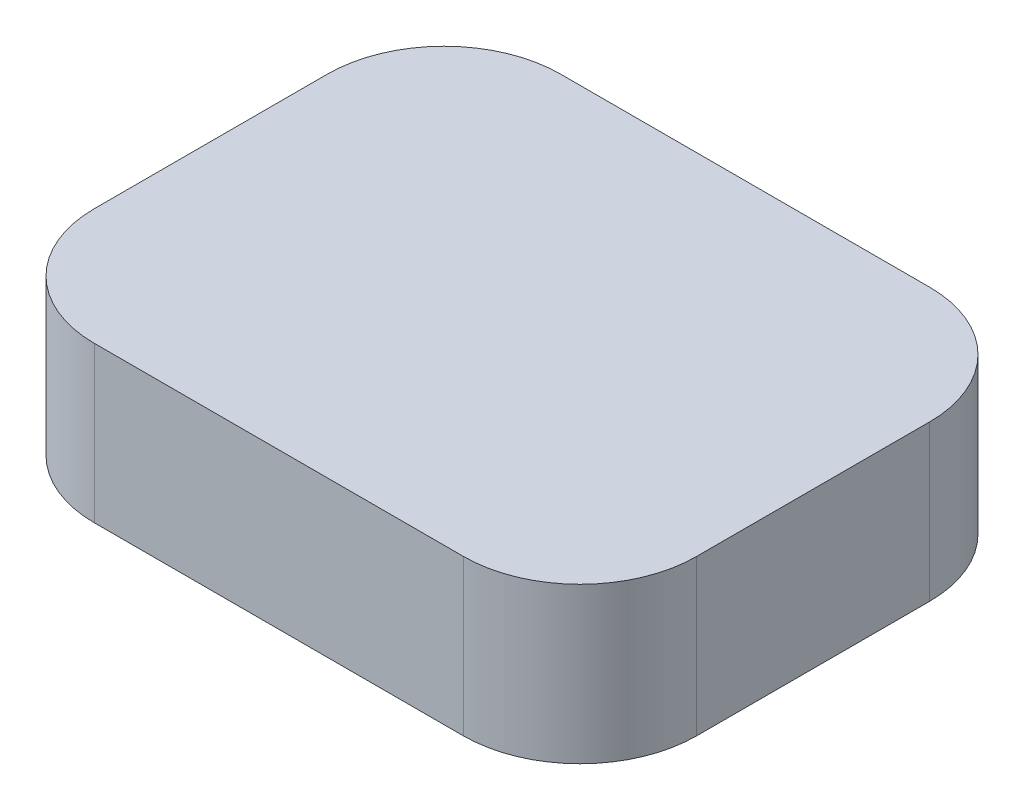
ISO-10303-21;
HEADER;
FILE_DESCRIPTION(('STEP AP214'),'2;1');
FILE_NAME('part.step','',(''),(''),'','','');
FILE_SCHEMA(('AUTOMOTIVE_DESIGN { 1 0 10303 214 1 1 1 1 }'));
ENDSEC;
DATA;
#1=APPLICATION_CONTEXT('core data for automotive mechanical design processes');
#2=APPLICATION_PROTOCOL_DEFINITION('international standard','automotive_design',2000,#1);
#3=PRODUCT_CONTEXT('',#1,'mechanical');
#4=PRODUCT('Part','Part','',(#3));
#5=PRODUCT_RELATED_PRODUCT_CATEGORY('part','',(#4));
#6=PRODUCT_DEFINITION_FORMATION('','',#4);
#7=PRODUCT_DEFINITION_CONTEXT('part definition',#1,'design');
#8=PRODUCT_DEFINITION('design','',#6,#7);
#9=PRODUCT_DEFINITION_SHAPE('','',#8);
#10=(LENGTH_UNIT() NAMED_UNIT(*) SI_UNIT(.MILLI.,.METRE.));
#11=(NAMED_UNIT(*) PLANE_ANGLE_UNIT() SI_UNIT($,.RADIAN.));
#12=(NAMED_UNIT(*) SI_UNIT($,.STERADIAN.) SOLID_ANGLE_UNIT());
#13=UNCERTAINTY_MEASURE_WITH_UNIT(LENGTH_MEASURE(1.E-05),#10,'distance_accuracy_value','');
#14=(GEOMETRIC_REPRESENTATION_CONTEXT(3) GLOBAL_UNCERTAINTY_ASSIGNED_CONTEXT((#13)) GLOBAL_UNIT_ASSIGNED_CONTEXT((#10,
#11,#12)) REPRESENTATION_CONTEXT('',''));
#15=CARTESIAN_POINT('',(0.,0.,0.));
#16=DIRECTION('',(0.,0.,1.));
#17=DIRECTION('',(1.,0.,0.));
#18=AXIS2_PLACEMENT_3D('',#15,#16,#17);
#19=CARTESIAN_POINT('',(15.5,8.,12.));
#20=DIRECTION('',(-1.,0.,0.));
#21=DIRECTION('',(0.,0.,1.));
#22=AXIS2_PLACEMENT_3D('',#19,#20,#21);
#23=PLANE('',#22);
#24=DIRECTION('',(0.,0.,-1.));
#25=VECTOR('',#24,1.);
#26=CARTESIAN_POINT('',(15.5,0.,12.));
#27=LINE('',#26,#25);
#28=CARTESIAN_POINT('',(15.5,0.,6.));
#29=VERTEX_POINT('',#28);
#30=CARTESIAN_POINT('',(15.5,0.,-6.00000000000001));
#31=VERTEX_POINT('',#30);
#32=EDGE_CURVE('E141',#29,#31,#27,.T.);
#33=ORIENTED_EDGE('',*,*,#32,.T.);
#34=DIRECTION('',(0.,-1.,0.));
#35=VECTOR('',#34,1.);
#36=CARTESIAN_POINT('',(15.5,8.,-6.00000000000001));
#37=LINE('',#36,#35);
#38=CARTESIAN_POINT('',(15.5,8.,-6.00000000000001));
#39=VERTEX_POINT('',#38);
#40=EDGE_CURVE('E11',#31,#39,#37,.F.);
#41=ORIENTED_EDGE('',*,*,#40,.T.);
#42=DIRECTION('',(0.,0.,-1.));
#43=VECTOR('',#42,1.);
#44=CARTESIAN_POINT('',(15.5,8.,12.));
#45=LINE('',#44,#43);
#46=CARTESIAN_POINT('',(15.5,8.,6.));
#47=VERTEX_POINT('',#46);
#48=EDGE_CURVE('E139',#47,#39,#45,.T.);
#49=ORIENTED_EDGE('',*,*,#48,.F.);
#50=DIRECTION('',(0.,-1.,0.));
#51=VECTOR('',#50,1.);
#52=CARTESIAN_POINT('',(15.5,8.,6.));
#53=LINE('',#52,#51);
#54=EDGE_CURVE('E53',#47,#29,#53,.T.);
#55=ORIENTED_EDGE('',*,*,#54,.T.);
#56=EDGE_LOOP('',(#33,#41,#49,#55));
#57=FACE_BOUND('',#56,.T.);
#58=ADVANCED_FACE('F45',(#57),#23,.F.);
#59=CARTESIAN_POINT('',(-15.5,8.,-12.));
#60=DIRECTION('',(0.,0.,1.));
#61=DIRECTION('',(1.,0.,0.));
#62=AXIS2_PLACEMENT_3D('',#59,#60,#61);
#63=PLANE('',#62);
#64=DIRECTION('',(-1.,0.,0.));
#65=VECTOR('',#64,1.);
#66=CARTESIAN_POINT('',(-15.5,0.,-12.));
#67=LINE('',#66,#65);
#68=CARTESIAN_POINT('',(9.50000000000001,0.,-12.));
#69=VERTEX_POINT('',#68);
#70=CARTESIAN_POINT('',(-9.49999999999999,0.,-12.));
#71=VERTEX_POINT('',#70);
#72=EDGE_CURVE('E137',#69,#71,#67,.T.);
#73=ORIENTED_EDGE('',*,*,#72,.T.);
#74=DIRECTION('',(0.,-1.,0.));
#75=VECTOR('',#74,1.);
#76=CARTESIAN_POINT('',(-9.49999999999999,8.,-12.));
#77=LINE('',#76,#75);
#78=CARTESIAN_POINT('',(-9.49999999999999,8.,-12.));
#79=VERTEX_POINT('',#78);
#80=EDGE_CURVE('E116',#71,#79,#77,.F.);
#81=ORIENTED_EDGE('',*,*,#80,.T.);
#82=DIRECTION('',(-1.,0.,0.));
#83=VECTOR('',#82,1.);
#84=CARTESIAN_POINT('',(-15.5,8.,-12.));
#85=LINE('',#84,#83);
#86=CARTESIAN_POINT('',(9.50000000000001,8.,-12.));
#87=VERTEX_POINT('',#86);
#88=EDGE_CURVE('E177',#87,#79,#85,.T.);
#89=ORIENTED_EDGE('',*,*,#88,.F.);
#90=DIRECTION('',(0.,-1.,0.));
#91=VECTOR('',#90,1.);
#92=CARTESIAN_POINT('',(9.50000000000001,8.,-12.));
#93=LINE('',#92,#91);
#94=EDGE_CURVE('E121',#87,#69,#93,.T.);
#95=ORIENTED_EDGE('',*,*,#94,.T.);
#96=EDGE_LOOP('',(#73,#81,#89,#95));
#97=FACE_BOUND('',#96,.T.);
#98=ADVANCED_FACE('F187',(#97),#63,.F.);
#99=CARTESIAN_POINT('',(-15.5,8.,12.));
#100=DIRECTION('',(1.,0.,0.));
#101=DIRECTION('',(0.,0.,-1.));
#102=AXIS2_PLACEMENT_3D('',#99,#100,#101);
#103=PLANE('',#102);
#104=DIRECTION('',(0.,0.,1.));
#105=VECTOR('',#104,1.);
#106=CARTESIAN_POINT('',(-15.5,8.,12.));
#107=LINE('',#106,#105);
#108=CARTESIAN_POINT('',(-15.5,8.,-6.00000000000001));
#109=VERTEX_POINT('',#108);
#110=CARTESIAN_POINT('',(-15.5,8.,6.));
#111=VERTEX_POINT('',#110);
#112=EDGE_CURVE('E130',#109,#111,#107,.T.);
#113=ORIENTED_EDGE('',*,*,#112,.F.);
#114=DIRECTION('',(0.,-1.,0.));
#115=VECTOR('',#114,1.);
#116=CARTESIAN_POINT('',(-15.5,8.,-6.00000000000001));
#117=LINE('',#116,#115);
#118=CARTESIAN_POINT('',(-15.5,0.,-6.00000000000001));
#119=VERTEX_POINT('',#118);
#120=EDGE_CURVE('E115',#109,#119,#117,.T.);
#121=ORIENTED_EDGE('',*,*,#120,.T.);
#122=DIRECTION('',(0.,0.,1.));
#123=VECTOR('',#122,1.);
#124=CARTESIAN_POINT('',(-15.5,0.,12.));
#125=LINE('',#124,#123);
#126=CARTESIAN_POINT('',(-15.5,0.,6.));
#127=VERTEX_POINT('',#126);
#128=EDGE_CURVE('E128',#119,#127,#125,.T.);
#129=ORIENTED_EDGE('',*,*,#128,.T.);
#130=DIRECTION('',(0.,-1.,0.));
#131=VECTOR('',#130,1.);
#132=CARTESIAN_POINT('',(-15.5,8.,6.));
#133=LINE('',#132,#131);
#134=EDGE_CURVE('E132',#127,#111,#133,.F.);
#135=ORIENTED_EDGE('',*,*,#134,.T.);
#136=EDGE_LOOP('',(#113,#121,#129,#135));
#137=FACE_BOUND('',#136,.T.);
#138=ADVANCED_FACE('F127',(#137),#103,.F.);
#139=CARTESIAN_POINT('',(-15.5,8.,12.));
#140=DIRECTION('',(0.,0.,-1.));
#141=DIRECTION('',(-1.,0.,0.));
#142=AXIS2_PLACEMENT_3D('',#139,#140,#141);
#143=PLANE('',#142);
#144=DIRECTION('',(1.,0.,0.));
#145=VECTOR('',#144,1.);
#146=CARTESIAN_POINT('',(-15.5,8.,12.));
#147=LINE('',#146,#145);
#148=CARTESIAN_POINT('',(-9.49999999999999,8.,12.));
#149=VERTEX_POINT('',#148);
#150=CARTESIAN_POINT('',(9.50000000000001,8.,12.));
#151=VERTEX_POINT('',#150);
#152=EDGE_CURVE('E145',#149,#151,#147,.T.);
#153=ORIENTED_EDGE('',*,*,#152,.F.);
#154=DIRECTION('',(0.,-1.,0.));
#155=VECTOR('',#154,1.);
#156=CARTESIAN_POINT('',(-9.49999999999999,8.,12.));
#157=LINE('',#156,#155);
#158=CARTESIAN_POINT('',(-9.49999999999999,0.,12.));
#159=VERTEX_POINT('',#158);
#160=EDGE_CURVE('E162',#149,#159,#157,.T.);
#161=ORIENTED_EDGE('',*,*,#160,.T.);
#162=DIRECTION('',(1.,0.,0.));
#163=VECTOR('',#162,1.);
#164=CARTESIAN_POINT('',(-15.5,0.,12.));
#165=LINE('',#164,#163);
#166=CARTESIAN_POINT('',(9.50000000000001,0.,12.));
#167=VERTEX_POINT('',#166);
#168=EDGE_CURVE('E136',#159,#167,#165,.T.);
#169=ORIENTED_EDGE('',*,*,#168,.T.);
#170=DIRECTION('',(0.,-1.,0.));
#171=VECTOR('',#170,1.);
#172=CARTESIAN_POINT('',(9.50000000000001,8.,12.));
#173=LINE('',#172,#171);
#174=EDGE_CURVE('E60',#167,#151,#173,.F.);
#175=ORIENTED_EDGE('',*,*,#174,.T.);
#176=EDGE_LOOP('',(#153,#161,#169,#175));
#177=FACE_BOUND('',#176,.T.);
#178=ADVANCED_FACE('F191',(#177),#143,.F.);
#179=CARTESIAN_POINT('',(0.,8.,0.));
#180=DIRECTION('',(0.,-1.,0.));
#181=DIRECTION('',(0.,0.,-1.));
#182=AXIS2_PLACEMENT_3D('',#179,#180,#181);
#183=PLANE('',#182);
#184=ORIENTED_EDGE('',*,*,#88,.T.);
#185=CARTESIAN_POINT('',(-9.49999999999999,8.,-6.00000000000001));
#186=DIRECTION('',(0.,-1.,0.));
#187=DIRECTION('',(0.,0.,-1.));
#188=AXIS2_PLACEMENT_3D('',#185,#186,#187);
#189=CIRCLE('',#188,6.);
#190=EDGE_CURVE('E159',#79,#109,#189,.F.);
#191=ORIENTED_EDGE('',*,*,#190,.T.);
#192=ORIENTED_EDGE('',*,*,#112,.T.);
#193=CARTESIAN_POINT('',(-9.49999999999999,8.,6.));
#194=DIRECTION('',(0.,-1.,0.));
#195=DIRECTION('',(0.,0.,-1.));
#196=AXIS2_PLACEMENT_3D('',#193,#194,#195);
#197=CIRCLE('',#196,6.);
#198=EDGE_CURVE('E67',#111,#149,#197,.F.);
#199=ORIENTED_EDGE('',*,*,#198,.T.);
#200=ORIENTED_EDGE('',*,*,#152,.T.);
#201=CARTESIAN_POINT('',(9.50000000000001,8.,6.));
#202=DIRECTION('',(0.,-1.,0.));
#203=DIRECTION('',(0.,0.,-1.));
#204=AXIS2_PLACEMENT_3D('',#201,#202,#203);
#205=CIRCLE('',#204,6.);
#206=EDGE_CURVE('E154',#151,#47,#205,.F.);
#207=ORIENTED_EDGE('',*,*,#206,.T.);
#208=ORIENTED_EDGE('',*,*,#48,.T.);
#209=CARTESIAN_POINT('',(9.50000000000001,8.,-6.));
#210=DIRECTION('',(0.,-1.,0.));
#211=DIRECTION('',(0.,0.,-1.));
#212=AXIS2_PLACEMENT_3D('',#209,#210,#211);
#213=CIRCLE('',#212,6.);
#214=EDGE_CURVE('E156',#39,#87,#213,.F.);
#215=ORIENTED_EDGE('',*,*,#214,.T.);
#216=EDGE_LOOP('',(#184,#191,#192,#199,#200,#207,#208,#215));
#217=FACE_BOUND('',#216,.T.);
#218=ADVANCED_FACE('F181',(#217),#183,.F.);
#219=CARTESIAN_POINT('',(0.,0.,0.));
#220=DIRECTION('',(0.,-1.,0.));
#221=DIRECTION('',(0.,0.,-1.));
#222=AXIS2_PLACEMENT_3D('',#219,#220,#221);
#223=PLANE('',#222);
#224=ORIENTED_EDGE('',*,*,#128,.F.);
#225=CARTESIAN_POINT('',(-9.49999999999999,0.,-6.00000000000001));
#226=DIRECTION('',(0.,-1.,0.));
#227=DIRECTION('',(0.,0.,-1.));
#228=AXIS2_PLACEMENT_3D('',#225,#226,#227);
#229=CIRCLE('',#228,6.);
#230=EDGE_CURVE('E111',#119,#71,#229,.T.);
#231=ORIENTED_EDGE('',*,*,#230,.T.);
#232=ORIENTED_EDGE('',*,*,#72,.F.);
#233=CARTESIAN_POINT('',(9.50000000000001,0.,-6.));
#234=DIRECTION('',(0.,-1.,0.));
#235=DIRECTION('',(0.,0.,-1.));
#236=AXIS2_PLACEMENT_3D('',#233,#234,#235);
#237=CIRCLE('',#236,6.);
#238=EDGE_CURVE('E148',#69,#31,#237,.T.);
#239=ORIENTED_EDGE('',*,*,#238,.T.);
#240=ORIENTED_EDGE('',*,*,#32,.F.);
#241=CARTESIAN_POINT('',(9.50000000000001,0.,6.));
#242=DIRECTION('',(0.,-1.,0.));
#243=DIRECTION('',(0.,0.,-1.));
#244=AXIS2_PLACEMENT_3D('',#241,#242,#243);
#245=CIRCLE('',#244,6.);
#246=EDGE_CURVE('E131',#29,#167,#245,.T.);
#247=ORIENTED_EDGE('',*,*,#246,.T.);
#248=ORIENTED_EDGE('',*,*,#168,.F.);
#249=CARTESIAN_POINT('',(-9.49999999999999,0.,6.));
#250=DIRECTION('',(0.,-1.,0.));
#251=DIRECTION('',(0.,0.,-1.));
#252=AXIS2_PLACEMENT_3D('',#249,#250,#251);
#253=CIRCLE('',#252,6.);
#254=EDGE_CURVE('E122',#159,#127,#253,.T.);
#255=ORIENTED_EDGE('',*,*,#254,.T.);
#256=EDGE_LOOP('',(#224,#231,#232,#239,#240,#247,#248,#255));
#257=FACE_BOUND('',#256,.T.);
#258=ADVANCED_FACE('F134',(#257),#223,.T.);
#259=CARTESIAN_POINT('',(-9.49999999999999,8.,-6.00000000000001));
#260=DIRECTION('',(0.,-1.,0.));
#261=DIRECTION('',(0.,0.,-1.));
#262=AXIS2_PLACEMENT_3D('',#259,#260,#261);
#263=CYLINDRICAL_SURFACE('',#262,6.);
#264=ORIENTED_EDGE('',*,*,#190,.F.);
#265=ORIENTED_EDGE('',*,*,#80,.F.);
#266=ORIENTED_EDGE('',*,*,#230,.F.);
#267=ORIENTED_EDGE('',*,*,#120,.F.);
#268=EDGE_LOOP('',(#264,#265,#266,#267));
#269=FACE_BOUND('',#268,.T.);
#270=ADVANCED_FACE('F114',(#269),#263,.T.);
#271=CARTESIAN_POINT('',(-9.49999999999999,8.,6.));
#272=DIRECTION('',(0.,-1.,0.));
#273=DIRECTION('',(0.,0.,-1.));
#274=AXIS2_PLACEMENT_3D('',#271,#272,#273);
#275=CYLINDRICAL_SURFACE('',#274,6.);
#276=ORIENTED_EDGE('',*,*,#198,.F.);
#277=ORIENTED_EDGE('',*,*,#134,.F.);
#278=ORIENTED_EDGE('',*,*,#254,.F.);
#279=ORIENTED_EDGE('',*,*,#160,.F.);
#280=EDGE_LOOP('',(#276,#277,#278,#279));
#281=FACE_BOUND('',#280,.T.);
#282=ADVANCED_FACE('F190',(#281),#275,.T.);
#283=CARTESIAN_POINT('',(9.50000000000001,8.,-6.));
#284=DIRECTION('',(0.,-1.,0.));
#285=DIRECTION('',(0.,0.,-1.));
#286=AXIS2_PLACEMENT_3D('',#283,#284,#285);
#287=CYLINDRICAL_SURFACE('',#286,6.);
#288=ORIENTED_EDGE('',*,*,#214,.F.);
#289=ORIENTED_EDGE('',*,*,#40,.F.);
#290=ORIENTED_EDGE('',*,*,#238,.F.);
#291=ORIENTED_EDGE('',*,*,#94,.F.);
#292=EDGE_LOOP('',(#288,#289,#290,#291));
#293=FACE_BOUND('',#292,.T.);
#294=ADVANCED_FACE('F185',(#293),#287,.T.);
#295=CARTESIAN_POINT('',(9.50000000000001,8.,6.));
#296=DIRECTION('',(0.,-1.,0.));
#297=DIRECTION('',(0.,0.,-1.));
#298=AXIS2_PLACEMENT_3D('',#295,#296,#297);
#299=CYLINDRICAL_SURFACE('',#298,6.);
#300=ORIENTED_EDGE('',*,*,#206,.F.);
#301=ORIENTED_EDGE('',*,*,#174,.F.);
#302=ORIENTED_EDGE('',*,*,#246,.F.);
#303=ORIENTED_EDGE('',*,*,#54,.F.);
#304=EDGE_LOOP('',(#300,#301,#302,#303));
#305=FACE_BOUND('',#304,.T.);
#306=ADVANCED_FACE('F47',(#305),#299,.T.);
#307=CLOSED_SHELL('',(#58,#98,#138,#178,#218,#258,#270,#282,#294,#306));
#308=MANIFOLD_SOLID_BREP('B2',#307);
#309=ADVANCED_BREP_SHAPE_REPRESENTATION('',(#18,#308),#14);
#310=SHAPE_DEFINITION_REPRESENTATION(#9,#309);
ENDSEC;
END-ISO-10303-21;
